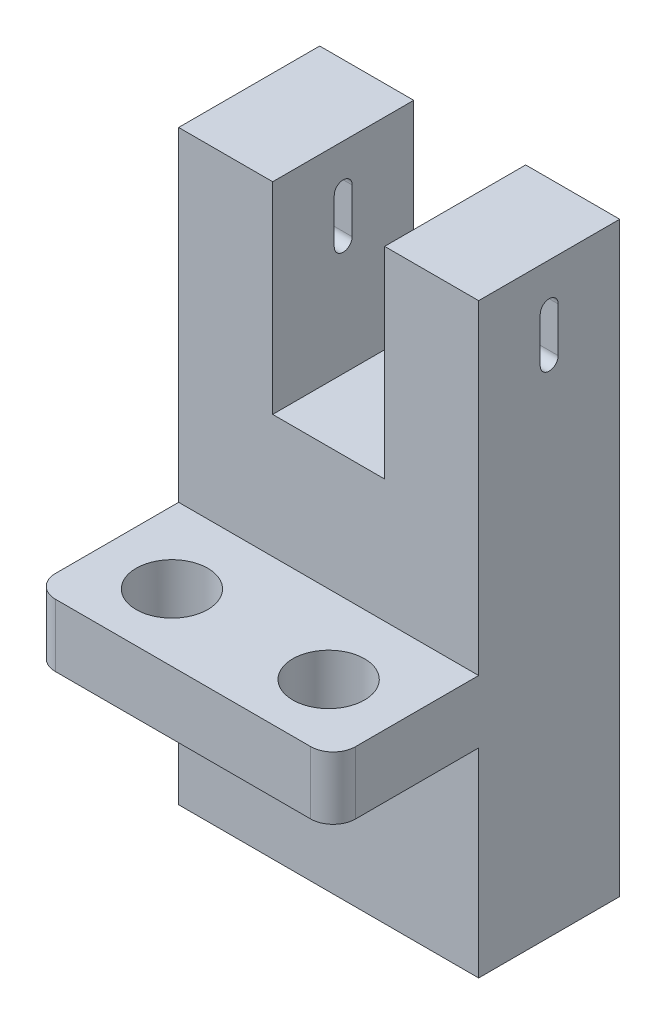
ISO-10303-21;
HEADER;
FILE_DESCRIPTION(('STEP AP214'),'2;1');
FILE_NAME('part.step','',(''),(''),'','','');
FILE_SCHEMA(('AUTOMOTIVE_DESIGN { 1 0 10303 214 1 1 1 1 }'));
ENDSEC;
DATA;
#1=APPLICATION_CONTEXT('core data for automotive mechanical design processes');
#2=APPLICATION_PROTOCOL_DEFINITION('international standard','automotive_design',2000,#1);
#3=PRODUCT_CONTEXT('',#1,'mechanical');
#4=PRODUCT('Part','Part','',(#3));
#5=PRODUCT_RELATED_PRODUCT_CATEGORY('part','',(#4));
#6=PRODUCT_DEFINITION_FORMATION('','',#4);
#7=PRODUCT_DEFINITION_CONTEXT('part definition',#1,'design');
#8=PRODUCT_DEFINITION('design','',#6,#7);
#9=PRODUCT_DEFINITION_SHAPE('','',#8);
#10=(LENGTH_UNIT() NAMED_UNIT(*) SI_UNIT(.MILLI.,.METRE.));
#11=(NAMED_UNIT(*) PLANE_ANGLE_UNIT() SI_UNIT($,.RADIAN.));
#12=(NAMED_UNIT(*) SI_UNIT($,.STERADIAN.) SOLID_ANGLE_UNIT());
#13=UNCERTAINTY_MEASURE_WITH_UNIT(LENGTH_MEASURE(1.E-05),#10,'distance_accuracy_value','');
#14=(GEOMETRIC_REPRESENTATION_CONTEXT(3) GLOBAL_UNCERTAINTY_ASSIGNED_CONTEXT((#13)) GLOBAL_UNIT_ASSIGNED_CONTEXT((#10,
#11,#12)) REPRESENTATION_CONTEXT('',''));
#15=CARTESIAN_POINT('',(0.,0.,0.));
#16=DIRECTION('',(0.,0.,1.));
#17=DIRECTION('',(1.,0.,0.));
#18=AXIS2_PLACEMENT_3D('',#15,#16,#17);
#19=CARTESIAN_POINT('',(6.7,26.2,3.15));
#20=DIRECTION('',(0.,-1.,0.));
#21=DIRECTION('',(0.,0.,-1.));
#22=AXIS2_PLACEMENT_3D('',#19,#20,#21);
#23=PLANE('',#22);
#24=DIRECTION('',(-1.,0.,0.));
#25=VECTOR('',#24,1.);
#26=CARTESIAN_POINT('',(6.7,26.2,-3.15));
#27=LINE('',#26,#25);
#28=CARTESIAN_POINT('',(6.7,26.2,-3.15));
#29=VERTEX_POINT('',#28);
#30=CARTESIAN_POINT('',(2.5,26.2,-3.15));
#31=VERTEX_POINT('',#30);
#32=EDGE_CURVE('E370',#29,#31,#27,.T.);
#33=ORIENTED_EDGE('',*,*,#32,.T.);
#34=DIRECTION('',(0.,0.,1.));
#35=VECTOR('',#34,1.);
#36=CARTESIAN_POINT('',(2.5,26.2,-3.15));
#37=LINE('',#36,#35);
#38=CARTESIAN_POINT('',(2.5,26.2,3.15));
#39=VERTEX_POINT('',#38);
#40=EDGE_CURVE('E285',#31,#39,#37,.T.);
#41=ORIENTED_EDGE('',*,*,#40,.T.);
#42=DIRECTION('',(-1.,0.,0.));
#43=VECTOR('',#42,1.);
#44=CARTESIAN_POINT('',(6.7,26.2,3.15));
#45=LINE('',#44,#43);
#46=CARTESIAN_POINT('',(6.7,26.2,3.15));
#47=VERTEX_POINT('',#46);
#48=EDGE_CURVE('E365',#47,#39,#45,.T.);
#49=ORIENTED_EDGE('',*,*,#48,.F.);
#50=DIRECTION('',(0.,0.,1.));
#51=VECTOR('',#50,1.);
#52=CARTESIAN_POINT('',(6.7,26.2,3.15));
#53=LINE('',#52,#51);
#54=EDGE_CURVE('E312',#29,#47,#53,.T.);
#55=ORIENTED_EDGE('',*,*,#54,.F.);
#56=EDGE_LOOP('',(#33,#41,#49,#55));
#57=FACE_BOUND('',#56,.T.);
#58=ADVANCED_FACE('F39',(#57),#23,.F.);
#59=CARTESIAN_POINT('',(6.7,0.,3.15));
#60=DIRECTION('',(0.,0.,-1.));
#61=DIRECTION('',(-1.,0.,0.));
#62=AXIS2_PLACEMENT_3D('',#59,#60,#61);
#63=PLANE('',#62);
#64=DIRECTION('',(0.,-1.,0.));
#65=VECTOR('',#64,1.);
#66=CARTESIAN_POINT('',(-6.7,0.,3.15));
#67=LINE('',#66,#65);
#68=CARTESIAN_POINT('',(-6.7,8.9,3.15));
#69=VERTEX_POINT('',#68);
#70=CARTESIAN_POINT('',(-6.7,0.,3.15));
#71=VERTEX_POINT('',#70);
#72=EDGE_CURVE('E290',#69,#71,#67,.T.);
#73=ORIENTED_EDGE('',*,*,#72,.T.);
#74=DIRECTION('',(-1.,0.,0.));
#75=VECTOR('',#74,1.);
#76=CARTESIAN_POINT('',(6.7,0.,3.15));
#77=LINE('',#76,#75);
#78=CARTESIAN_POINT('',(6.7,0.,3.15));
#79=VERTEX_POINT('',#78);
#80=EDGE_CURVE('E378',#79,#71,#77,.T.);
#81=ORIENTED_EDGE('',*,*,#80,.F.);
#82=DIRECTION('',(0.,-1.,0.));
#83=VECTOR('',#82,1.);
#84=CARTESIAN_POINT('',(6.7,0.,3.15));
#85=LINE('',#84,#83);
#86=CARTESIAN_POINT('',(6.7,8.9,3.15));
#87=VERTEX_POINT('',#86);
#88=EDGE_CURVE('E301',#87,#79,#85,.T.);
#89=ORIENTED_EDGE('',*,*,#88,.F.);
#90=DIRECTION('',(-1.,0.,0.));
#91=VECTOR('',#90,1.);
#92=CARTESIAN_POINT('',(6.7,8.9,3.15));
#93=LINE('',#92,#91);
#94=EDGE_CURVE('E325',#87,#69,#93,.T.);
#95=ORIENTED_EDGE('',*,*,#94,.T.);
#96=EDGE_LOOP('',(#73,#81,#89,#95));
#97=FACE_BOUND('',#96,.T.);
#98=ADVANCED_FACE('F455',(#97),#63,.F.);
#99=CARTESIAN_POINT('',(6.7,0.,-3.15));
#100=DIRECTION('',(0.,1.,0.));
#101=DIRECTION('',(0.,0.,1.));
#102=AXIS2_PLACEMENT_3D('',#99,#100,#101);
#103=PLANE('',#102);
#104=DIRECTION('',(0.,0.,-1.));
#105=VECTOR('',#104,1.);
#106=CARTESIAN_POINT('',(-6.7,0.,-3.15));
#107=LINE('',#106,#105);
#108=CARTESIAN_POINT('',(-6.7,0.,-3.15));
#109=VERTEX_POINT('',#108);
#110=EDGE_CURVE('E329',#71,#109,#107,.T.);
#111=ORIENTED_EDGE('',*,*,#110,.T.);
#112=DIRECTION('',(-1.,0.,0.));
#113=VECTOR('',#112,1.);
#114=CARTESIAN_POINT('',(6.7,0.,-3.15));
#115=LINE('',#114,#113);
#116=CARTESIAN_POINT('',(6.7,0.,-3.15));
#117=VERTEX_POINT('',#116);
#118=EDGE_CURVE('E374',#117,#109,#115,.T.);
#119=ORIENTED_EDGE('',*,*,#118,.F.);
#120=DIRECTION('',(0.,0.,-1.));
#121=VECTOR('',#120,1.);
#122=CARTESIAN_POINT('',(6.7,0.,-3.15));
#123=LINE('',#122,#121);
#124=EDGE_CURVE('E305',#79,#117,#123,.T.);
#125=ORIENTED_EDGE('',*,*,#124,.F.);
#126=ORIENTED_EDGE('',*,*,#80,.T.);
#127=EDGE_LOOP('',(#111,#119,#125,#126));
#128=FACE_BOUND('',#127,.T.);
#129=ADVANCED_FACE('F462',(#128),#103,.F.);
#130=CARTESIAN_POINT('',(6.7,26.2,-3.15));
#131=DIRECTION('',(0.,0.,1.));
#132=DIRECTION('',(0.,-1.,0.));
#133=AXIS2_PLACEMENT_3D('',#130,#131,#132);
#134=PLANE('',#133);
#135=DIRECTION('',(1.,0.,0.));
#136=VECTOR('',#135,1.);
#137=CARTESIAN_POINT('',(-2.5,17.2,-3.15));
#138=LINE('',#137,#136);
#139=CARTESIAN_POINT('',(-2.5,17.2,-3.15));
#140=VERTEX_POINT('',#139);
#141=CARTESIAN_POINT('',(2.5,17.2,-3.15));
#142=VERTEX_POINT('',#141);
#143=EDGE_CURVE('E281',#140,#142,#138,.T.);
#144=ORIENTED_EDGE('',*,*,#143,.T.);
#145=DIRECTION('',(0.,1.,0.));
#146=VECTOR('',#145,1.);
#147=CARTESIAN_POINT('',(2.5,26.2,-3.15));
#148=LINE('',#147,#146);
#149=EDGE_CURVE('E272',#142,#31,#148,.T.);
#150=ORIENTED_EDGE('',*,*,#149,.T.);
#151=ORIENTED_EDGE('',*,*,#32,.F.);
#152=DIRECTION('',(0.,1.,0.));
#153=VECTOR('',#152,1.);
#154=CARTESIAN_POINT('',(6.7,26.2,-3.15));
#155=LINE('',#154,#153);
#156=EDGE_CURVE('E309',#117,#29,#155,.T.);
#157=ORIENTED_EDGE('',*,*,#156,.F.);
#158=ORIENTED_EDGE('',*,*,#118,.T.);
#159=DIRECTION('',(0.,1.,0.));
#160=VECTOR('',#159,1.);
#161=CARTESIAN_POINT('',(-6.7,26.2,-3.15));
#162=LINE('',#161,#160);
#163=CARTESIAN_POINT('',(-6.7,26.2,-3.15));
#164=VERTEX_POINT('',#163);
#165=EDGE_CURVE('E332',#109,#164,#162,.T.);
#166=ORIENTED_EDGE('',*,*,#165,.T.);
#167=CARTESIAN_POINT('',(-2.5,26.2,-3.15));
#168=VERTEX_POINT('',#167);
#169=EDGE_CURVE('E369',#168,#164,#27,.T.);
#170=ORIENTED_EDGE('',*,*,#169,.F.);
#171=DIRECTION('',(0.,-1.,0.));
#172=VECTOR('',#171,1.);
#173=CARTESIAN_POINT('',(-2.5,26.2,-3.15));
#174=LINE('',#173,#172);
#175=EDGE_CURVE('E276',#168,#140,#174,.T.);
#176=ORIENTED_EDGE('',*,*,#175,.T.);
#177=EDGE_LOOP('',(#144,#150,#151,#157,#158,#166,#170,#176));
#178=FACE_BOUND('',#177,.T.);
#179=ADVANCED_FACE('F469',(#178),#134,.F.);
#180=CARTESIAN_POINT('',(-2.5,26.2,3.15));
#181=VERTEX_POINT('',#180);
#182=CARTESIAN_POINT('',(-6.7,26.2,3.15));
#183=VERTEX_POINT('',#182);
#184=EDGE_CURVE('E364',#181,#183,#45,.T.);
#185=ORIENTED_EDGE('',*,*,#184,.F.);
#186=DIRECTION('',(0.,0.,1.));
#187=VECTOR('',#186,1.);
#188=CARTESIAN_POINT('',(-2.5,26.2,-3.15));
#189=LINE('',#188,#187);
#190=EDGE_CURVE('E295',#168,#181,#189,.T.);
#191=ORIENTED_EDGE('',*,*,#190,.F.);
#192=ORIENTED_EDGE('',*,*,#169,.T.);
#193=DIRECTION('',(0.,0.,1.));
#194=VECTOR('',#193,1.);
#195=CARTESIAN_POINT('',(-6.7,26.2,3.15));
#196=LINE('',#195,#194);
#197=EDGE_CURVE('E336',#164,#183,#196,.T.);
#198=ORIENTED_EDGE('',*,*,#197,.T.);
#199=EDGE_LOOP('',(#185,#191,#192,#198));
#200=FACE_BOUND('',#199,.T.);
#201=ADVANCED_FACE('F458',(#200),#23,.F.);
#202=CARTESIAN_POINT('',(6.7,11.7,3.15));
#203=DIRECTION('',(0.,0.,-1.));
#204=DIRECTION('',(-1.,0.,0.));
#205=AXIS2_PLACEMENT_3D('',#202,#203,#204);
#206=PLANE('',#205);
#207=ORIENTED_EDGE('',*,*,#48,.T.);
#208=DIRECTION('',(0.,-1.,0.));
#209=VECTOR('',#208,1.);
#210=CARTESIAN_POINT('',(2.5,11.7,3.15));
#211=LINE('',#210,#209);
#212=CARTESIAN_POINT('',(2.5,17.2,3.15));
#213=VERTEX_POINT('',#212);
#214=EDGE_CURVE('E390',#39,#213,#211,.T.);
#215=ORIENTED_EDGE('',*,*,#214,.T.);
#216=DIRECTION('',(-1.,0.,0.));
#217=VECTOR('',#216,1.);
#218=CARTESIAN_POINT('',(6.7,17.2,3.15));
#219=LINE('',#218,#217);
#220=CARTESIAN_POINT('',(-2.5,17.2,3.15));
#221=VERTEX_POINT('',#220);
#222=EDGE_CURVE('E386',#213,#221,#219,.T.);
#223=ORIENTED_EDGE('',*,*,#222,.T.);
#224=DIRECTION('',(0.,1.,0.));
#225=VECTOR('',#224,1.);
#226=CARTESIAN_POINT('',(-2.5,11.7,3.15));
#227=LINE('',#226,#225);
#228=EDGE_CURVE('E382',#221,#181,#227,.T.);
#229=ORIENTED_EDGE('',*,*,#228,.T.);
#230=ORIENTED_EDGE('',*,*,#184,.T.);
#231=DIRECTION('',(0.,-1.,0.));
#232=VECTOR('',#231,1.);
#233=CARTESIAN_POINT('',(-6.7,11.7,3.15));
#234=LINE('',#233,#232);
#235=CARTESIAN_POINT('',(-6.7,11.7,3.15));
#236=VERTEX_POINT('',#235);
#237=EDGE_CURVE('E340',#183,#236,#234,.T.);
#238=ORIENTED_EDGE('',*,*,#237,.T.);
#239=DIRECTION('',(-1.,0.,0.));
#240=VECTOR('',#239,1.);
#241=CARTESIAN_POINT('',(6.7,11.7,3.15));
#242=LINE('',#241,#240);
#243=CARTESIAN_POINT('',(6.7,11.7,3.15));
#244=VERTEX_POINT('',#243);
#245=EDGE_CURVE('E360',#244,#236,#242,.T.);
#246=ORIENTED_EDGE('',*,*,#245,.F.);
#247=DIRECTION('',(0.,-1.,0.));
#248=VECTOR('',#247,1.);
#249=CARTESIAN_POINT('',(6.7,11.7,3.15));
#250=LINE('',#249,#248);
#251=EDGE_CURVE('E315',#47,#244,#250,.T.);
#252=ORIENTED_EDGE('',*,*,#251,.F.);
#253=EDGE_LOOP('',(#207,#215,#223,#229,#230,#238,#246,#252));
#254=FACE_BOUND('',#253,.T.);
#255=ADVANCED_FACE('F468',(#254),#206,.F.);
#256=CARTESIAN_POINT('',(6.7,11.7,9.65));
#257=DIRECTION('',(0.,-1.,0.));
#258=DIRECTION('',(0.,0.,-1.));
#259=AXIS2_PLACEMENT_3D('',#256,#257,#258);
#260=PLANE('',#259);
#261=CARTESIAN_POINT('',(3.5,11.7,6.65));
#262=DIRECTION('',(0.,1.,0.));
#263=DIRECTION('',(0.,0.,1.));
#264=AXIS2_PLACEMENT_3D('',#261,#262,#263);
#265=CIRCLE('',#264,1.6);
#266=CARTESIAN_POINT('',(3.5,11.7,8.25));
#267=VERTEX_POINT('',#266);
#268=EDGE_CURVE('E264',#267,#267,#265,.T.);
#269=ORIENTED_EDGE('',*,*,#268,.F.);
#270=EDGE_LOOP('',(#269));
#271=FACE_BOUND('',#270,.T.);
#272=CARTESIAN_POINT('',(-3.5,11.7,6.65));
#273=DIRECTION('',(0.,1.,0.));
#274=DIRECTION('',(0.,0.,-1.));
#275=AXIS2_PLACEMENT_3D('',#272,#273,#274);
#276=CIRCLE('',#275,1.6);
#277=CARTESIAN_POINT('',(-3.5,11.7,5.05));
#278=VERTEX_POINT('',#277);
#279=EDGE_CURVE('E263',#278,#278,#276,.T.);
#280=ORIENTED_EDGE('',*,*,#279,.F.);
#281=EDGE_LOOP('',(#280));
#282=FACE_BOUND('',#281,.T.);
#283=DIRECTION('',(-1.,0.,0.));
#284=VECTOR('',#283,1.);
#285=CARTESIAN_POINT('',(6.7,11.7,9.65));
#286=LINE('',#285,#284);
#287=CARTESIAN_POINT('',(5.7,11.7,9.65));
#288=VERTEX_POINT('',#287);
#289=CARTESIAN_POINT('',(-5.7,11.7,9.65));
#290=VERTEX_POINT('',#289);
#291=EDGE_CURVE('E356',#288,#290,#286,.T.);
#292=ORIENTED_EDGE('',*,*,#291,.F.);
#293=CARTESIAN_POINT('',(5.7,11.7,8.65));
#294=DIRECTION('',(0.,-1.,0.));
#295=DIRECTION('',(0.,0.,-1.));
#296=AXIS2_PLACEMENT_3D('',#293,#294,#295);
#297=CIRCLE('',#296,1.);
#298=CARTESIAN_POINT('',(6.7,11.7,8.65));
#299=VERTEX_POINT('',#298);
#300=EDGE_CURVE('E414',#288,#299,#297,.F.);
#301=ORIENTED_EDGE('',*,*,#300,.T.);
#302=DIRECTION('',(0.,0.,1.));
#303=VECTOR('',#302,1.);
#304=CARTESIAN_POINT('',(6.7,11.7,9.65));
#305=LINE('',#304,#303);
#306=EDGE_CURVE('E318',#244,#299,#305,.T.);
#307=ORIENTED_EDGE('',*,*,#306,.F.);
#308=ORIENTED_EDGE('',*,*,#245,.T.);
#309=DIRECTION('',(0.,0.,1.));
#310=VECTOR('',#309,1.);
#311=CARTESIAN_POINT('',(-6.7,11.7,9.65));
#312=LINE('',#311,#310);
#313=CARTESIAN_POINT('',(-6.7,11.7,8.65));
#314=VERTEX_POINT('',#313);
#315=EDGE_CURVE('E343',#236,#314,#312,.T.);
#316=ORIENTED_EDGE('',*,*,#315,.T.);
#317=CARTESIAN_POINT('',(-5.7,11.7,8.65));
#318=DIRECTION('',(0.,-1.,0.));
#319=DIRECTION('',(0.,0.,-1.));
#320=AXIS2_PLACEMENT_3D('',#317,#318,#319);
#321=CIRCLE('',#320,1.);
#322=EDGE_CURVE('E411',#314,#290,#321,.F.);
#323=ORIENTED_EDGE('',*,*,#322,.T.);
#324=EDGE_LOOP('',(#292,#301,#307,#308,#316,#323));
#325=FACE_BOUND('',#324,.T.);
#326=ADVANCED_FACE('F475',(#271,#282,#325),#260,.F.);
#327=CARTESIAN_POINT('',(6.7,8.9,9.65));
#328=DIRECTION('',(0.,0.,-1.));
#329=DIRECTION('',(-1.,0.,0.));
#330=AXIS2_PLACEMENT_3D('',#327,#328,#329);
#331=PLANE('',#330);
#332=DIRECTION('',(-1.,0.,0.));
#333=VECTOR('',#332,1.);
#334=CARTESIAN_POINT('',(6.7,8.9,9.65));
#335=LINE('',#334,#333);
#336=CARTESIAN_POINT('',(5.7,8.9,9.65));
#337=VERTEX_POINT('',#336);
#338=CARTESIAN_POINT('',(-5.7,8.9,9.65));
#339=VERTEX_POINT('',#338);
#340=EDGE_CURVE('E352',#337,#339,#335,.T.);
#341=ORIENTED_EDGE('',*,*,#340,.F.);
#342=DIRECTION('',(0.,-1.,0.));
#343=VECTOR('',#342,1.);
#344=CARTESIAN_POINT('',(5.7,11.7,9.65));
#345=LINE('',#344,#343);
#346=EDGE_CURVE('E408',#337,#288,#345,.F.);
#347=ORIENTED_EDGE('',*,*,#346,.T.);
#348=ORIENTED_EDGE('',*,*,#291,.T.);
#349=DIRECTION('',(0.,-1.,0.));
#350=VECTOR('',#349,1.);
#351=CARTESIAN_POINT('',(-5.7,8.9,9.65));
#352=LINE('',#351,#350);
#353=EDGE_CURVE('E404',#290,#339,#352,.T.);
#354=ORIENTED_EDGE('',*,*,#353,.T.);
#355=EDGE_LOOP('',(#341,#347,#348,#354));
#356=FACE_BOUND('',#355,.T.);
#357=ADVANCED_FACE('F536',(#356),#331,.F.);
#358=CARTESIAN_POINT('',(6.7,8.9,3.15));
#359=DIRECTION('',(0.,1.,0.));
#360=DIRECTION('',(0.,0.,1.));
#361=AXIS2_PLACEMENT_3D('',#358,#359,#360);
#362=PLANE('',#361);
#363=CARTESIAN_POINT('',(3.5,8.9,6.65));
#364=DIRECTION('',(0.,1.,0.));
#365=DIRECTION('',(0.,0.,1.));
#366=AXIS2_PLACEMENT_3D('',#363,#364,#365);
#367=CIRCLE('',#366,1.6);
#368=CARTESIAN_POINT('',(3.5,8.9,8.25));
#369=VERTEX_POINT('',#368);
#370=EDGE_CURVE('E277',#369,#369,#367,.T.);
#371=ORIENTED_EDGE('',*,*,#370,.T.);
#372=EDGE_LOOP('',(#371));
#373=FACE_BOUND('',#372,.T.);
#374=CARTESIAN_POINT('',(-3.5,8.9,6.65));
#375=DIRECTION('',(0.,1.,0.));
#376=DIRECTION('',(0.,0.,1.));
#377=AXIS2_PLACEMENT_3D('',#374,#375,#376);
#378=CIRCLE('',#377,1.6);
#379=CARTESIAN_POINT('',(-3.5,8.9,8.25));
#380=VERTEX_POINT('',#379);
#381=EDGE_CURVE('E268',#380,#380,#378,.T.);
#382=ORIENTED_EDGE('',*,*,#381,.T.);
#383=EDGE_LOOP('',(#382));
#384=FACE_BOUND('',#383,.T.);
#385=DIRECTION('',(0.,0.,-1.));
#386=VECTOR('',#385,1.);
#387=CARTESIAN_POINT('',(6.7,8.9,3.15));
#388=LINE('',#387,#386);
#389=CARTESIAN_POINT('',(6.7,8.9,8.65));
#390=VERTEX_POINT('',#389);
#391=EDGE_CURVE('E322',#390,#87,#388,.T.);
#392=ORIENTED_EDGE('',*,*,#391,.F.);
#393=CARTESIAN_POINT('',(5.7,8.9,8.65));
#394=DIRECTION('',(0.,1.,0.));
#395=DIRECTION('',(0.,0.,1.));
#396=AXIS2_PLACEMENT_3D('',#393,#394,#395);
#397=CIRCLE('',#396,1.);
#398=EDGE_CURVE('E401',#390,#337,#397,.F.);
#399=ORIENTED_EDGE('',*,*,#398,.T.);
#400=ORIENTED_EDGE('',*,*,#340,.T.);
#401=CARTESIAN_POINT('',(-5.7,8.9,8.65));
#402=DIRECTION('',(0.,1.,0.));
#403=DIRECTION('',(0.,0.,1.));
#404=AXIS2_PLACEMENT_3D('',#401,#402,#403);
#405=CIRCLE('',#404,1.);
#406=CARTESIAN_POINT('',(-6.7,8.9,8.65));
#407=VERTEX_POINT('',#406);
#408=EDGE_CURVE('E398',#339,#407,#405,.F.);
#409=ORIENTED_EDGE('',*,*,#408,.T.);
#410=DIRECTION('',(0.,0.,-1.));
#411=VECTOR('',#410,1.);
#412=CARTESIAN_POINT('',(-6.7,8.9,3.15));
#413=LINE('',#412,#411);
#414=EDGE_CURVE('E306',#407,#69,#413,.T.);
#415=ORIENTED_EDGE('',*,*,#414,.T.);
#416=ORIENTED_EDGE('',*,*,#94,.F.);
#417=EDGE_LOOP('',(#392,#399,#400,#409,#415,#416));
#418=FACE_BOUND('',#417,.T.);
#419=ADVANCED_FACE('F531',(#373,#384,#418),#362,.F.);
#420=CARTESIAN_POINT('',(6.7,0.,0.));
#421=DIRECTION('',(1.,0.,0.));
#422=DIRECTION('',(0.,0.,-1.));
#423=AXIS2_PLACEMENT_3D('',#420,#421,#422);
#424=PLANE('',#423);
#425=CARTESIAN_POINT('',(6.7,24.3,0.));
#426=DIRECTION('',(1.,0.,0.));
#427=DIRECTION('',(0.,0.,-1.));
#428=AXIS2_PLACEMENT_3D('',#425,#426,#427);
#429=CIRCLE('',#428,0.4);
#430=CARTESIAN_POINT('',(6.7,24.3,-0.399999999999999));
#431=VERTEX_POINT('',#430);
#432=CARTESIAN_POINT('',(6.7,24.3,0.400000000000001));
#433=VERTEX_POINT('',#432);
#434=EDGE_CURVE('E55',#431,#433,#429,.T.);
#435=ORIENTED_EDGE('',*,*,#434,.F.);
#436=DIRECTION('',(0.,1.,0.));
#437=VECTOR('',#436,1.);
#438=CARTESIAN_POINT('',(6.7,24.3,-0.399999999999999));
#439=LINE('',#438,#437);
#440=CARTESIAN_POINT('',(6.7,22.3,-0.4));
#441=VERTEX_POINT('',#440);
#442=EDGE_CURVE('E216',#441,#431,#439,.T.);
#443=ORIENTED_EDGE('',*,*,#442,.F.);
#444=CARTESIAN_POINT('',(6.7,22.3,0.));
#445=DIRECTION('',(1.,0.,0.));
#446=DIRECTION('',(0.,0.,-1.));
#447=AXIS2_PLACEMENT_3D('',#444,#445,#446);
#448=CIRCLE('',#447,0.4);
#449=CARTESIAN_POINT('',(6.7,22.3,0.4));
#450=VERTEX_POINT('',#449);
#451=EDGE_CURVE('E220',#450,#441,#448,.T.);
#452=ORIENTED_EDGE('',*,*,#451,.F.);
#453=DIRECTION('',(0.,-1.,0.));
#454=VECTOR('',#453,1.);
#455=CARTESIAN_POINT('',(6.7,24.3,0.400000000000001));
#456=LINE('',#455,#454);
#457=EDGE_CURVE('E229',#433,#450,#456,.T.);
#458=ORIENTED_EDGE('',*,*,#457,.F.);
#459=EDGE_LOOP('',(#435,#443,#452,#458));
#460=FACE_BOUND('',#459,.T.);
#461=ORIENTED_EDGE('',*,*,#306,.T.);
#462=DIRECTION('',(0.,-1.,0.));
#463=VECTOR('',#462,1.);
#464=CARTESIAN_POINT('',(6.7,8.9,8.65));
#465=LINE('',#464,#463);
#466=EDGE_CURVE('E394',#299,#390,#465,.T.);
#467=ORIENTED_EDGE('',*,*,#466,.T.);
#468=ORIENTED_EDGE('',*,*,#391,.T.);
#469=ORIENTED_EDGE('',*,*,#88,.T.);
#470=ORIENTED_EDGE('',*,*,#124,.T.);
#471=ORIENTED_EDGE('',*,*,#156,.T.);
#472=ORIENTED_EDGE('',*,*,#54,.T.);
#473=ORIENTED_EDGE('',*,*,#251,.T.);
#474=EDGE_LOOP('',(#461,#467,#468,#469,#470,#471,#472,#473));
#475=FACE_BOUND('',#474,.T.);
#476=ADVANCED_FACE('F493',(#460,#475),#424,.T.);
#477=CARTESIAN_POINT('',(-6.7,0.,0.));
#478=DIRECTION('',(1.,0.,0.));
#479=DIRECTION('',(0.,0.,-1.));
#480=AXIS2_PLACEMENT_3D('',#477,#478,#479);
#481=PLANE('',#480);
#482=DIRECTION('',(0.,1.,0.));
#483=VECTOR('',#482,1.);
#484=CARTESIAN_POINT('',(-6.7,24.3,-0.399999999999999));
#485=LINE('',#484,#483);
#486=CARTESIAN_POINT('',(-6.7,22.3,-0.4));
#487=VERTEX_POINT('',#486);
#488=CARTESIAN_POINT('',(-6.7,24.3,-0.399999999999999));
#489=VERTEX_POINT('',#488);
#490=EDGE_CURVE('E214',#487,#489,#485,.T.);
#491=ORIENTED_EDGE('',*,*,#490,.T.);
#492=CARTESIAN_POINT('',(-6.7,24.3,0.));
#493=DIRECTION('',(1.,0.,0.));
#494=DIRECTION('',(0.,0.,-1.));
#495=AXIS2_PLACEMENT_3D('',#492,#493,#494);
#496=CIRCLE('',#495,0.4);
#497=CARTESIAN_POINT('',(-6.7,24.3,0.400000000000001));
#498=VERTEX_POINT('',#497);
#499=EDGE_CURVE('E196',#489,#498,#496,.T.);
#500=ORIENTED_EDGE('',*,*,#499,.T.);
#501=DIRECTION('',(0.,-1.,0.));
#502=VECTOR('',#501,1.);
#503=CARTESIAN_POINT('',(-6.7,24.3,0.400000000000001));
#504=LINE('',#503,#502);
#505=CARTESIAN_POINT('',(-6.7,22.3,0.4));
#506=VERTEX_POINT('',#505);
#507=EDGE_CURVE('E205',#498,#506,#504,.T.);
#508=ORIENTED_EDGE('',*,*,#507,.T.);
#509=CARTESIAN_POINT('',(-6.7,22.3,0.));
#510=DIRECTION('',(1.,0.,0.));
#511=DIRECTION('',(0.,0.,-1.));
#512=AXIS2_PLACEMENT_3D('',#509,#510,#511);
#513=CIRCLE('',#512,0.4);
#514=EDGE_CURVE('E63',#506,#487,#513,.T.);
#515=ORIENTED_EDGE('',*,*,#514,.T.);
#516=EDGE_LOOP('',(#491,#500,#508,#515));
#517=FACE_BOUND('',#516,.T.);
#518=ORIENTED_EDGE('',*,*,#414,.F.);
#519=DIRECTION('',(0.,-1.,0.));
#520=VECTOR('',#519,1.);
#521=CARTESIAN_POINT('',(-6.7,0.,8.65));
#522=LINE('',#521,#520);
#523=EDGE_CURVE('E417',#407,#314,#522,.F.);
#524=ORIENTED_EDGE('',*,*,#523,.T.);
#525=ORIENTED_EDGE('',*,*,#315,.F.);
#526=ORIENTED_EDGE('',*,*,#237,.F.);
#527=ORIENTED_EDGE('',*,*,#197,.F.);
#528=ORIENTED_EDGE('',*,*,#165,.F.);
#529=ORIENTED_EDGE('',*,*,#110,.F.);
#530=ORIENTED_EDGE('',*,*,#72,.F.);
#531=EDGE_LOOP('',(#518,#524,#525,#526,#527,#528,#529,#530));
#532=FACE_BOUND('',#531,.T.);
#533=ADVANCED_FACE('F211',(#517,#532),#481,.F.);
#534=CARTESIAN_POINT('',(2.5,26.2,-3.15));
#535=DIRECTION('',(1.,0.,0.));
#536=DIRECTION('',(0.,1.,0.));
#537=AXIS2_PLACEMENT_3D('',#534,#535,#536);
#538=PLANE('',#537);
#539=DIRECTION('',(0.,1.,0.));
#540=VECTOR('',#539,1.);
#541=CARTESIAN_POINT('',(2.5,26.2,-0.399999999999999));
#542=LINE('',#541,#540);
#543=CARTESIAN_POINT('',(2.5,22.3,-0.4));
#544=VERTEX_POINT('',#543);
#545=CARTESIAN_POINT('',(2.5,24.3,-0.399999999999999));
#546=VERTEX_POINT('',#545);
#547=EDGE_CURVE('E255',#544,#546,#542,.T.);
#548=ORIENTED_EDGE('',*,*,#547,.T.);
#549=CARTESIAN_POINT('',(2.5,24.3,0.));
#550=DIRECTION('',(1.,0.,0.));
#551=DIRECTION('',(0.,1.,0.));
#552=AXIS2_PLACEMENT_3D('',#549,#550,#551);
#553=CIRCLE('',#552,0.4);
#554=CARTESIAN_POINT('',(2.5,24.3,0.400000000000001));
#555=VERTEX_POINT('',#554);
#556=EDGE_CURVE('E259',#546,#555,#553,.T.);
#557=ORIENTED_EDGE('',*,*,#556,.T.);
#558=DIRECTION('',(0.,-1.,0.));
#559=VECTOR('',#558,1.);
#560=CARTESIAN_POINT('',(2.5,26.2,0.400000000000001));
#561=LINE('',#560,#559);
#562=CARTESIAN_POINT('',(2.5,22.3,0.4));
#563=VERTEX_POINT('',#562);
#564=EDGE_CURVE('E239',#555,#563,#561,.T.);
#565=ORIENTED_EDGE('',*,*,#564,.T.);
#566=CARTESIAN_POINT('',(2.5,22.3,0.));
#567=DIRECTION('',(1.,0.,0.));
#568=DIRECTION('',(0.,1.,0.));
#569=AXIS2_PLACEMENT_3D('',#566,#567,#568);
#570=CIRCLE('',#569,0.4);
#571=EDGE_CURVE('E251',#563,#544,#570,.T.);
#572=ORIENTED_EDGE('',*,*,#571,.T.);
#573=EDGE_LOOP('',(#548,#557,#565,#572));
#574=FACE_BOUND('',#573,.T.);
#575=ORIENTED_EDGE('',*,*,#40,.F.);
#576=ORIENTED_EDGE('',*,*,#149,.F.);
#577=DIRECTION('',(0.,0.,1.));
#578=VECTOR('',#577,1.);
#579=CARTESIAN_POINT('',(2.5,17.2,-3.15));
#580=LINE('',#579,#578);
#581=EDGE_CURVE('E286',#142,#213,#580,.T.);
#582=ORIENTED_EDGE('',*,*,#581,.T.);
#583=ORIENTED_EDGE('',*,*,#214,.F.);
#584=EDGE_LOOP('',(#575,#576,#582,#583));
#585=FACE_BOUND('',#584,.T.);
#586=ADVANCED_FACE('F499',(#574,#585),#538,.F.);
#587=CARTESIAN_POINT('',(-2.5,17.2,-3.15));
#588=DIRECTION('',(0.,-1.,0.));
#589=DIRECTION('',(0.,0.,-1.));
#590=AXIS2_PLACEMENT_3D('',#587,#588,#589);
#591=PLANE('',#590);
#592=ORIENTED_EDGE('',*,*,#581,.F.);
#593=ORIENTED_EDGE('',*,*,#143,.F.);
#594=DIRECTION('',(0.,0.,1.));
#595=VECTOR('',#594,1.);
#596=CARTESIAN_POINT('',(-2.5,17.2,-3.15));
#597=LINE('',#596,#595);
#598=EDGE_CURVE('E291',#140,#221,#597,.T.);
#599=ORIENTED_EDGE('',*,*,#598,.T.);
#600=ORIENTED_EDGE('',*,*,#222,.F.);
#601=EDGE_LOOP('',(#592,#593,#599,#600));
#602=FACE_BOUND('',#601,.T.);
#603=ADVANCED_FACE('F520',(#602),#591,.F.);
#604=CARTESIAN_POINT('',(-2.5,26.2,-3.15));
#605=DIRECTION('',(-1.,0.,0.));
#606=DIRECTION('',(0.,-1.,0.));
#607=AXIS2_PLACEMENT_3D('',#604,#605,#606);
#608=PLANE('',#607);
#609=DIRECTION('',(0.,1.,0.));
#610=VECTOR('',#609,1.);
#611=CARTESIAN_POINT('',(-2.5,26.2,0.400000000000001));
#612=LINE('',#611,#610);
#613=CARTESIAN_POINT('',(-2.5,22.3,0.4));
#614=VERTEX_POINT('',#613);
#615=CARTESIAN_POINT('',(-2.5,24.3,0.400000000000001));
#616=VERTEX_POINT('',#615);
#617=EDGE_CURVE('E420',#614,#616,#612,.T.);
#618=ORIENTED_EDGE('',*,*,#617,.T.);
#619=CARTESIAN_POINT('',(-2.5,24.3,0.));
#620=DIRECTION('',(-1.,0.,0.));
#621=DIRECTION('',(0.,-1.,0.));
#622=AXIS2_PLACEMENT_3D('',#619,#620,#621);
#623=CIRCLE('',#622,0.4);
#624=CARTESIAN_POINT('',(-2.5,24.3,-0.399999999999999));
#625=VERTEX_POINT('',#624);
#626=EDGE_CURVE('E11',#616,#625,#623,.T.);
#627=ORIENTED_EDGE('',*,*,#626,.T.);
#628=DIRECTION('',(0.,-1.,0.));
#629=VECTOR('',#628,1.);
#630=CARTESIAN_POINT('',(-2.5,26.2,-0.399999999999999));
#631=LINE('',#630,#629);
#632=CARTESIAN_POINT('',(-2.5,22.3,-0.4));
#633=VERTEX_POINT('',#632);
#634=EDGE_CURVE('E48',#625,#633,#631,.T.);
#635=ORIENTED_EDGE('',*,*,#634,.T.);
#636=CARTESIAN_POINT('',(-2.5,22.3,0.));
#637=DIRECTION('',(-1.,0.,0.));
#638=DIRECTION('',(0.,-1.,0.));
#639=AXIS2_PLACEMENT_3D('',#636,#637,#638);
#640=CIRCLE('',#639,0.4);
#641=EDGE_CURVE('E429',#633,#614,#640,.T.);
#642=ORIENTED_EDGE('',*,*,#641,.T.);
#643=EDGE_LOOP('',(#618,#627,#635,#642));
#644=FACE_BOUND('',#643,.T.);
#645=ORIENTED_EDGE('',*,*,#598,.F.);
#646=ORIENTED_EDGE('',*,*,#175,.F.);
#647=ORIENTED_EDGE('',*,*,#190,.T.);
#648=ORIENTED_EDGE('',*,*,#228,.F.);
#649=EDGE_LOOP('',(#645,#646,#647,#648));
#650=FACE_BOUND('',#649,.T.);
#651=ADVANCED_FACE('F435',(#644,#650),#608,.F.);
#652=CARTESIAN_POINT('',(5.7,0.,8.65));
#653=DIRECTION('',(0.,1.,0.));
#654=DIRECTION('',(0.,0.,1.));
#655=AXIS2_PLACEMENT_3D('',#652,#653,#654);
#656=CYLINDRICAL_SURFACE('',#655,1.);
#657=ORIENTED_EDGE('',*,*,#300,.F.);
#658=ORIENTED_EDGE('',*,*,#346,.F.);
#659=ORIENTED_EDGE('',*,*,#398,.F.);
#660=ORIENTED_EDGE('',*,*,#466,.F.);
#661=EDGE_LOOP('',(#657,#658,#659,#660));
#662=FACE_BOUND('',#661,.T.);
#663=ADVANCED_FACE('F526',(#662),#656,.T.);
#664=CARTESIAN_POINT('',(-5.7,8.9,8.65));
#665=DIRECTION('',(0.,-1.,0.));
#666=DIRECTION('',(0.,0.,-1.));
#667=AXIS2_PLACEMENT_3D('',#664,#665,#666);
#668=CYLINDRICAL_SURFACE('',#667,1.);
#669=ORIENTED_EDGE('',*,*,#322,.F.);
#670=ORIENTED_EDGE('',*,*,#523,.F.);
#671=ORIENTED_EDGE('',*,*,#408,.F.);
#672=ORIENTED_EDGE('',*,*,#353,.F.);
#673=EDGE_LOOP('',(#669,#670,#671,#672));
#674=FACE_BOUND('',#673,.T.);
#675=ADVANCED_FACE('F41',(#674),#668,.T.);
#676=CARTESIAN_POINT('',(-3.5,-1.7,6.65));
#677=DIRECTION('',(0.,1.,0.));
#678=DIRECTION('',(0.,0.,1.));
#679=AXIS2_PLACEMENT_3D('',#676,#677,#678);
#680=CYLINDRICAL_SURFACE('',#679,1.6);
#681=ORIENTED_EDGE('',*,*,#279,.T.);
#682=EDGE_LOOP('',(#681));
#683=FACE_BOUND('',#682,.T.);
#684=ORIENTED_EDGE('',*,*,#381,.F.);
#685=EDGE_LOOP('',(#684));
#686=FACE_BOUND('',#685,.T.);
#687=ADVANCED_FACE('F515',(#683,#686),#680,.F.);
#688=CARTESIAN_POINT('',(3.5,-1.7,6.65));
#689=DIRECTION('',(0.,1.,0.));
#690=DIRECTION('',(0.,0.,1.));
#691=AXIS2_PLACEMENT_3D('',#688,#689,#690);
#692=CYLINDRICAL_SURFACE('',#691,1.6);
#693=ORIENTED_EDGE('',*,*,#268,.T.);
#694=EDGE_LOOP('',(#693));
#695=FACE_BOUND('',#694,.T.);
#696=ORIENTED_EDGE('',*,*,#370,.F.);
#697=EDGE_LOOP('',(#696));
#698=FACE_BOUND('',#697,.T.);
#699=ADVANCED_FACE('F449',(#695,#698),#692,.F.);
#700=CARTESIAN_POINT('',(-6.7,24.3,0.400000000000001));
#701=DIRECTION('',(0.,0.,1.));
#702=DIRECTION('',(0.,-1.,0.));
#703=AXIS2_PLACEMENT_3D('',#700,#701,#702);
#704=PLANE('',#703);
#705=DIRECTION('',(1.,0.,0.));
#706=VECTOR('',#705,1.);
#707=CARTESIAN_POINT('',(-6.7,22.3,0.4));
#708=LINE('',#707,#706);
#709=EDGE_CURVE('E207',#506,#614,#708,.T.);
#710=ORIENTED_EDGE('',*,*,#709,.F.);
#711=ORIENTED_EDGE('',*,*,#507,.F.);
#712=DIRECTION('',(1.,0.,0.));
#713=VECTOR('',#712,1.);
#714=CARTESIAN_POINT('',(-6.7,24.3,0.400000000000001));
#715=LINE('',#714,#713);
#716=EDGE_CURVE('E191',#498,#616,#715,.T.);
#717=ORIENTED_EDGE('',*,*,#716,.T.);
#718=ORIENTED_EDGE('',*,*,#617,.F.);
#719=EDGE_LOOP('',(#710,#711,#717,#718));
#720=FACE_BOUND('',#719,.T.);
#721=ADVANCED_FACE('F206',(#720),#704,.F.);
#722=CARTESIAN_POINT('',(-6.7,22.3,0.));
#723=DIRECTION('',(1.,0.,0.));
#724=DIRECTION('',(0.,0.,-1.));
#725=AXIS2_PLACEMENT_3D('',#722,#723,#724);
#726=CYLINDRICAL_SURFACE('',#725,0.4);
#727=DIRECTION('',(1.,0.,0.));
#728=VECTOR('',#727,1.);
#729=CARTESIAN_POINT('',(-6.7,22.3,-0.4));
#730=LINE('',#729,#728);
#731=EDGE_CURVE('E241',#487,#633,#730,.T.);
#732=ORIENTED_EDGE('',*,*,#731,.F.);
#733=ORIENTED_EDGE('',*,*,#514,.F.);
#734=ORIENTED_EDGE('',*,*,#709,.T.);
#735=ORIENTED_EDGE('',*,*,#641,.F.);
#736=EDGE_LOOP('',(#732,#733,#734,#735));
#737=FACE_BOUND('',#736,.T.);
#738=ADVANCED_FACE('F439',(#737),#726,.F.);
#739=CARTESIAN_POINT('',(-6.7,24.3,-0.399999999999999));
#740=DIRECTION('',(0.,0.,-1.));
#741=DIRECTION('',(0.,1.,0.));
#742=AXIS2_PLACEMENT_3D('',#739,#740,#741);
#743=PLANE('',#742);
#744=DIRECTION('',(1.,0.,0.));
#745=VECTOR('',#744,1.);
#746=CARTESIAN_POINT('',(-6.7,24.3,-0.399999999999999));
#747=LINE('',#746,#745);
#748=EDGE_CURVE('E236',#489,#625,#747,.T.);
#749=ORIENTED_EDGE('',*,*,#748,.F.);
#750=ORIENTED_EDGE('',*,*,#490,.F.);
#751=ORIENTED_EDGE('',*,*,#731,.T.);
#752=ORIENTED_EDGE('',*,*,#634,.F.);
#753=EDGE_LOOP('',(#749,#750,#751,#752));
#754=FACE_BOUND('',#753,.T.);
#755=ADVANCED_FACE('F438',(#754),#743,.F.);
#756=CARTESIAN_POINT('',(-6.7,24.3,0.));
#757=DIRECTION('',(1.,0.,0.));
#758=DIRECTION('',(0.,0.,-1.));
#759=AXIS2_PLACEMENT_3D('',#756,#757,#758);
#760=CYLINDRICAL_SURFACE('',#759,0.4);
#761=ORIENTED_EDGE('',*,*,#716,.F.);
#762=ORIENTED_EDGE('',*,*,#499,.F.);
#763=ORIENTED_EDGE('',*,*,#748,.T.);
#764=ORIENTED_EDGE('',*,*,#626,.F.);
#765=EDGE_LOOP('',(#761,#762,#763,#764));
#766=FACE_BOUND('',#765,.T.);
#767=ADVANCED_FACE('F193',(#766),#760,.F.);
#768=EDGE_CURVE('E240',#546,#431,#747,.T.);
#769=ORIENTED_EDGE('',*,*,#768,.T.);
#770=ORIENTED_EDGE('',*,*,#434,.T.);
#771=EDGE_CURVE('E202',#555,#433,#715,.T.);
#772=ORIENTED_EDGE('',*,*,#771,.F.);
#773=ORIENTED_EDGE('',*,*,#556,.F.);
#774=EDGE_LOOP('',(#769,#770,#772,#773));
#775=FACE_BOUND('',#774,.T.);
#776=ADVANCED_FACE('F502',(#775),#760,.F.);
#777=EDGE_CURVE('E245',#544,#441,#730,.T.);
#778=ORIENTED_EDGE('',*,*,#777,.T.);
#779=ORIENTED_EDGE('',*,*,#442,.T.);
#780=ORIENTED_EDGE('',*,*,#768,.F.);
#781=ORIENTED_EDGE('',*,*,#547,.F.);
#782=EDGE_LOOP('',(#778,#779,#780,#781));
#783=FACE_BOUND('',#782,.T.);
#784=ADVANCED_FACE('F448',(#783),#743,.F.);
#785=EDGE_CURVE('E201',#563,#450,#708,.T.);
#786=ORIENTED_EDGE('',*,*,#785,.T.);
#787=ORIENTED_EDGE('',*,*,#451,.T.);
#788=ORIENTED_EDGE('',*,*,#777,.F.);
#789=ORIENTED_EDGE('',*,*,#571,.F.);
#790=EDGE_LOOP('',(#786,#787,#788,#789));
#791=FACE_BOUND('',#790,.T.);
#792=ADVANCED_FACE('F442',(#791),#726,.F.);
#793=ORIENTED_EDGE('',*,*,#771,.T.);
#794=ORIENTED_EDGE('',*,*,#457,.T.);
#795=ORIENTED_EDGE('',*,*,#785,.F.);
#796=ORIENTED_EDGE('',*,*,#564,.F.);
#797=EDGE_LOOP('',(#793,#794,#795,#796));
#798=FACE_BOUND('',#797,.T.);
#799=ADVANCED_FACE('F451',(#798),#704,.F.);
#800=CLOSED_SHELL('',(#58,#98,#129,#179,#201,#255,#326,#357,#419,#476,#533,#586,#603,#651,#663,
#675,#687,#699,#721,#738,#755,#767,#776,#784,#792,#799));
#801=MANIFOLD_SOLID_BREP('B2',#800);
#802=ADVANCED_BREP_SHAPE_REPRESENTATION('',(#18,#801),#14);
#803=SHAPE_DEFINITION_REPRESENTATION(#9,#802);
ENDSEC;
END-ISO-10303-21;
